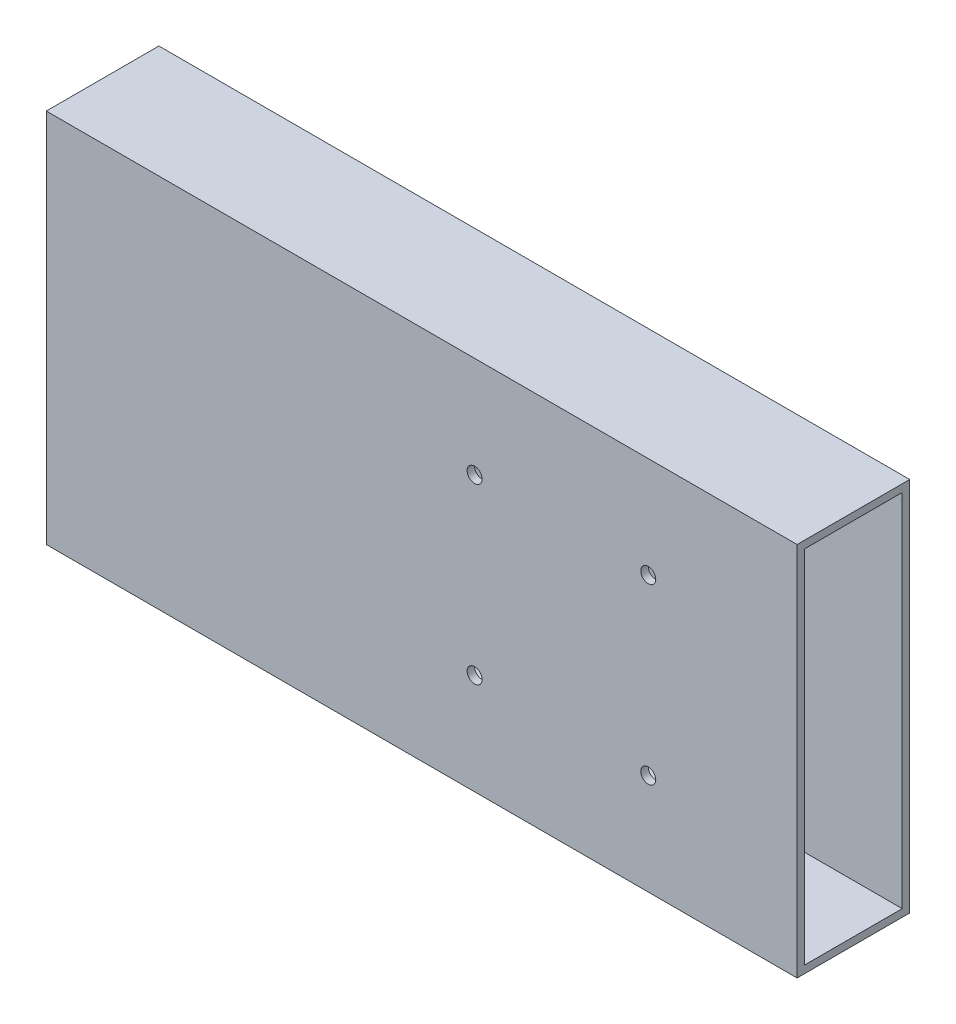
ISO-10303-21;
HEADER;
FILE_DESCRIPTION(('STEP AP214'),'2;1');
FILE_NAME('part.step','',(''),(''),'','','');
FILE_SCHEMA(('AUTOMOTIVE_DESIGN { 1 0 10303 214 1 1 1 1 }'));
ENDSEC;
DATA;
#1=APPLICATION_CONTEXT('core data for automotive mechanical design processes');
#2=APPLICATION_PROTOCOL_DEFINITION('international standard','automotive_design',2000,#1);
#3=PRODUCT_CONTEXT('',#1,'mechanical');
#4=PRODUCT('Part','Part','',(#3));
#5=PRODUCT_RELATED_PRODUCT_CATEGORY('part','',(#4));
#6=PRODUCT_DEFINITION_FORMATION('','',#4);
#7=PRODUCT_DEFINITION_CONTEXT('part definition',#1,'design');
#8=PRODUCT_DEFINITION('design','',#6,#7);
#9=PRODUCT_DEFINITION_SHAPE('','',#8);
#10=(LENGTH_UNIT() NAMED_UNIT(*) SI_UNIT(.MILLI.,.METRE.));
#11=(NAMED_UNIT(*) PLANE_ANGLE_UNIT() SI_UNIT($,.RADIAN.));
#12=(NAMED_UNIT(*) SI_UNIT($,.STERADIAN.) SOLID_ANGLE_UNIT());
#13=UNCERTAINTY_MEASURE_WITH_UNIT(LENGTH_MEASURE(1.E-05),#10,'distance_accuracy_value','');
#14=(GEOMETRIC_REPRESENTATION_CONTEXT(3) GLOBAL_UNCERTAINTY_ASSIGNED_CONTEXT((#13)) GLOBAL_UNIT_ASSIGNED_CONTEXT((#10,
#11,#12)) REPRESENTATION_CONTEXT('',''));
#15=CARTESIAN_POINT('',(0.,0.,0.));
#16=DIRECTION('',(0.,0.,1.));
#17=DIRECTION('',(1.,0.,0.));
#18=AXIS2_PLACEMENT_3D('',#15,#16,#17);
#19=CARTESIAN_POINT('',(0.,0.,60.));
#20=DIRECTION('',(-1.,0.,0.));
#21=DIRECTION('',(0.,0.,1.));
#22=AXIS2_PLACEMENT_3D('',#19,#20,#21);
#23=PLANE('',#22);
#24=DIRECTION('',(0.,1.,0.));
#25=VECTOR('',#24,1.);
#26=CARTESIAN_POINT('',(0.,0.,0.));
#27=LINE('',#26,#25);
#28=CARTESIAN_POINT('',(0.,0.,0.));
#29=VERTEX_POINT('',#28);
#30=CARTESIAN_POINT('',(0.,200.,0.));
#31=VERTEX_POINT('',#30);
#32=EDGE_CURVE('E127',#29,#31,#27,.T.);
#33=ORIENTED_EDGE('',*,*,#32,.T.);
#34=DIRECTION('',(0.,0.,-1.));
#35=VECTOR('',#34,1.);
#36=CARTESIAN_POINT('',(0.,200.,60.));
#37=LINE('',#36,#35);
#38=CARTESIAN_POINT('',(0.,200.,60.));
#39=VERTEX_POINT('',#38);
#40=EDGE_CURVE('E11',#39,#31,#37,.T.);
#41=ORIENTED_EDGE('',*,*,#40,.F.);
#42=DIRECTION('',(0.,1.,0.));
#43=VECTOR('',#42,1.);
#44=CARTESIAN_POINT('',(0.,0.,60.));
#45=LINE('',#44,#43);
#46=CARTESIAN_POINT('',(0.,0.,60.));
#47=VERTEX_POINT('',#46);
#48=EDGE_CURVE('E133',#47,#39,#45,.T.);
#49=ORIENTED_EDGE('',*,*,#48,.F.);
#50=DIRECTION('',(0.,0.,-1.));
#51=VECTOR('',#50,1.);
#52=CARTESIAN_POINT('',(0.,0.,60.));
#53=LINE('',#52,#51);
#54=EDGE_CURVE('E143',#47,#29,#53,.T.);
#55=ORIENTED_EDGE('',*,*,#54,.T.);
#56=EDGE_LOOP('',(#33,#41,#49,#55));
#57=FACE_BOUND('',#56,.T.);
#58=DIRECTION('',(0.,1.,0.));
#59=VECTOR('',#58,1.);
#60=CARTESIAN_POINT('',(0.,0.,4.));
#61=LINE('',#60,#59);
#62=CARTESIAN_POINT('',(0.,4.,4.));
#63=VERTEX_POINT('',#62);
#64=CARTESIAN_POINT('',(0.,196.,4.));
#65=VERTEX_POINT('',#64);
#66=EDGE_CURVE('E103',#63,#65,#61,.T.);
#67=ORIENTED_EDGE('',*,*,#66,.F.);
#68=DIRECTION('',(0.,0.,-1.));
#69=VECTOR('',#68,1.);
#70=CARTESIAN_POINT('',(0.,4.,60.));
#71=LINE('',#70,#69);
#72=CARTESIAN_POINT('',(0.,4.,56.));
#73=VERTEX_POINT('',#72);
#74=EDGE_CURVE('E123',#73,#63,#71,.T.);
#75=ORIENTED_EDGE('',*,*,#74,.F.);
#76=DIRECTION('',(0.,1.,0.));
#77=VECTOR('',#76,1.);
#78=CARTESIAN_POINT('',(0.,0.,56.));
#79=LINE('',#78,#77);
#80=CARTESIAN_POINT('',(0.,196.,56.));
#81=VERTEX_POINT('',#80);
#82=EDGE_CURVE('E47',#73,#81,#79,.T.);
#83=ORIENTED_EDGE('',*,*,#82,.T.);
#84=DIRECTION('',(0.,0.,-1.));
#85=VECTOR('',#84,1.);
#86=CARTESIAN_POINT('',(0.,196.,60.));
#87=LINE('',#86,#85);
#88=EDGE_CURVE('E113',#81,#65,#87,.T.);
#89=ORIENTED_EDGE('',*,*,#88,.T.);
#90=EDGE_LOOP('',(#67,#75,#83,#89));
#91=FACE_BOUND('',#90,.T.);
#92=ADVANCED_FACE('F33',(#57,#91),#23,.F.);
#93=CARTESIAN_POINT('',(-400.,0.,60.));
#94=DIRECTION('',(1.,0.,0.));
#95=DIRECTION('',(0.,0.,-1.));
#96=AXIS2_PLACEMENT_3D('',#93,#94,#95);
#97=PLANE('',#96);
#98=DIRECTION('',(0.,-1.,0.));
#99=VECTOR('',#98,1.);
#100=CARTESIAN_POINT('',(-400.,0.,0.));
#101=LINE('',#100,#99);
#102=CARTESIAN_POINT('',(-400.,200.,0.));
#103=VERTEX_POINT('',#102);
#104=CARTESIAN_POINT('',(-400.,0.,0.));
#105=VERTEX_POINT('',#104);
#106=EDGE_CURVE('E148',#103,#105,#101,.T.);
#107=ORIENTED_EDGE('',*,*,#106,.T.);
#108=DIRECTION('',(0.,0.,-1.));
#109=VECTOR('',#108,1.);
#110=CARTESIAN_POINT('',(-400.,0.,60.));
#111=LINE('',#110,#109);
#112=CARTESIAN_POINT('',(-400.,0.,60.));
#113=VERTEX_POINT('',#112);
#114=EDGE_CURVE('E153',#113,#105,#111,.T.);
#115=ORIENTED_EDGE('',*,*,#114,.F.);
#116=DIRECTION('',(0.,-1.,0.));
#117=VECTOR('',#116,1.);
#118=CARTESIAN_POINT('',(-400.,0.,60.));
#119=LINE('',#118,#117);
#120=CARTESIAN_POINT('',(-400.,200.,60.));
#121=VERTEX_POINT('',#120);
#122=EDGE_CURVE('E139',#121,#113,#119,.T.);
#123=ORIENTED_EDGE('',*,*,#122,.F.);
#124=DIRECTION('',(0.,0.,-1.));
#125=VECTOR('',#124,1.);
#126=CARTESIAN_POINT('',(-400.,200.,60.));
#127=LINE('',#126,#125);
#128=EDGE_CURVE('E40',#121,#103,#127,.T.);
#129=ORIENTED_EDGE('',*,*,#128,.T.);
#130=EDGE_LOOP('',(#107,#115,#123,#129));
#131=FACE_BOUND('',#130,.T.);
#132=DIRECTION('',(0.,-1.,0.));
#133=VECTOR('',#132,1.);
#134=CARTESIAN_POINT('',(-400.,0.,4.));
#135=LINE('',#134,#133);
#136=CARTESIAN_POINT('',(-400.,196.,4.));
#137=VERTEX_POINT('',#136);
#138=CARTESIAN_POINT('',(-400.,3.99999999999995,4.));
#139=VERTEX_POINT('',#138);
#140=EDGE_CURVE('E100',#137,#139,#135,.T.);
#141=ORIENTED_EDGE('',*,*,#140,.F.);
#142=DIRECTION('',(0.,0.,-1.));
#143=VECTOR('',#142,1.);
#144=CARTESIAN_POINT('',(-400.,196.,60.));
#145=LINE('',#144,#143);
#146=CARTESIAN_POINT('',(-400.,196.,56.));
#147=VERTEX_POINT('',#146);
#148=EDGE_CURVE('E109',#147,#137,#145,.T.);
#149=ORIENTED_EDGE('',*,*,#148,.F.);
#150=DIRECTION('',(0.,-1.,0.));
#151=VECTOR('',#150,1.);
#152=CARTESIAN_POINT('',(-400.,0.,56.));
#153=LINE('',#152,#151);
#154=CARTESIAN_POINT('',(-400.,3.99999999999995,56.));
#155=VERTEX_POINT('',#154);
#156=EDGE_CURVE('E52',#147,#155,#153,.T.);
#157=ORIENTED_EDGE('',*,*,#156,.T.);
#158=DIRECTION('',(0.,0.,-1.));
#159=VECTOR('',#158,1.);
#160=CARTESIAN_POINT('',(-400.,3.99999999999995,60.));
#161=LINE('',#160,#159);
#162=EDGE_CURVE('E114',#155,#139,#161,.T.);
#163=ORIENTED_EDGE('',*,*,#162,.T.);
#164=EDGE_LOOP('',(#141,#149,#157,#163));
#165=FACE_BOUND('',#164,.T.);
#166=ADVANCED_FACE('F117',(#131,#165),#97,.F.);
#167=CARTESIAN_POINT('',(0.,200.,60.));
#168=DIRECTION('',(0.,-1.,0.));
#169=DIRECTION('',(1.,0.,0.));
#170=AXIS2_PLACEMENT_3D('',#167,#168,#169);
#171=PLANE('',#170);
#172=DIRECTION('',(-1.,0.,0.));
#173=VECTOR('',#172,1.);
#174=CARTESIAN_POINT('',(0.,200.,0.));
#175=LINE('',#174,#173);
#176=EDGE_CURVE('E146',#31,#103,#175,.T.);
#177=ORIENTED_EDGE('',*,*,#176,.T.);
#178=ORIENTED_EDGE('',*,*,#128,.F.);
#179=DIRECTION('',(-1.,0.,0.));
#180=VECTOR('',#179,1.);
#181=CARTESIAN_POINT('',(0.,200.,60.));
#182=LINE('',#181,#180);
#183=EDGE_CURVE('E136',#39,#121,#182,.T.);
#184=ORIENTED_EDGE('',*,*,#183,.F.);
#185=ORIENTED_EDGE('',*,*,#40,.T.);
#186=EDGE_LOOP('',(#177,#178,#184,#185));
#187=FACE_BOUND('',#186,.T.);
#188=ADVANCED_FACE('F176',(#187),#171,.F.);
#189=CARTESIAN_POINT('',(0.,0.,60.));
#190=DIRECTION('',(0.,1.,0.));
#191=DIRECTION('',(-1.,0.,0.));
#192=AXIS2_PLACEMENT_3D('',#189,#190,#191);
#193=PLANE('',#192);
#194=DIRECTION('',(1.,0.,0.));
#195=VECTOR('',#194,1.);
#196=CARTESIAN_POINT('',(0.,0.,0.));
#197=LINE('',#196,#195);
#198=EDGE_CURVE('E137',#105,#29,#197,.T.);
#199=ORIENTED_EDGE('',*,*,#198,.T.);
#200=ORIENTED_EDGE('',*,*,#54,.F.);
#201=DIRECTION('',(1.,0.,0.));
#202=VECTOR('',#201,1.);
#203=CARTESIAN_POINT('',(0.,0.,60.));
#204=LINE('',#203,#202);
#205=EDGE_CURVE('E141',#113,#47,#204,.T.);
#206=ORIENTED_EDGE('',*,*,#205,.F.);
#207=ORIENTED_EDGE('',*,*,#114,.T.);
#208=EDGE_LOOP('',(#199,#200,#206,#207));
#209=FACE_BOUND('',#208,.T.);
#210=ADVANCED_FACE('F168',(#209),#193,.F.);
#211=CARTESIAN_POINT('',(0.,0.,60.));
#212=DIRECTION('',(0.,0.,1.));
#213=DIRECTION('',(1.,0.,0.));
#214=AXIS2_PLACEMENT_3D('',#211,#212,#213);
#215=PLANE('',#214);
#216=CARTESIAN_POINT('',(-171.797757223373,146.25,60.));
#217=DIRECTION('',(0.,0.,1.));
#218=DIRECTION('',(1.,0.,0.));
#219=AXIS2_PLACEMENT_3D('',#216,#217,#218);
#220=CIRCLE('',#219,3.99999999999999);
#221=CARTESIAN_POINT('',(-167.797757223373,146.25,60.));
#222=VERTEX_POINT('',#221);
#223=EDGE_CURVE('E301',#222,#222,#220,.T.);
#224=ORIENTED_EDGE('',*,*,#223,.F.);
#225=EDGE_LOOP('',(#224));
#226=FACE_BOUND('',#225,.T.);
#227=CARTESIAN_POINT('',(-79.2977572233733,53.75,60.));
#228=DIRECTION('',(0.,0.,1.));
#229=DIRECTION('',(-1.,0.,0.));
#230=AXIS2_PLACEMENT_3D('',#227,#228,#229);
#231=CIRCLE('',#230,4.00000000000001);
#232=CARTESIAN_POINT('',(-83.2977572233733,53.75,60.));
#233=VERTEX_POINT('',#232);
#234=EDGE_CURVE('E312',#233,#233,#231,.T.);
#235=ORIENTED_EDGE('',*,*,#234,.F.);
#236=EDGE_LOOP('',(#235));
#237=FACE_BOUND('',#236,.T.);
#238=CARTESIAN_POINT('',(-171.797757223373,53.75,60.));
#239=DIRECTION('',(0.,0.,1.));
#240=DIRECTION('',(-1.,0.,0.));
#241=AXIS2_PLACEMENT_3D('',#238,#239,#240);
#242=CIRCLE('',#241,3.99999999999999);
#243=CARTESIAN_POINT('',(-175.797757223373,53.75,60.));
#244=VERTEX_POINT('',#243);
#245=EDGE_CURVE('E318',#244,#244,#242,.T.);
#246=ORIENTED_EDGE('',*,*,#245,.F.);
#247=EDGE_LOOP('',(#246));
#248=FACE_BOUND('',#247,.T.);
#249=CARTESIAN_POINT('',(-79.2977572233733,146.25,60.));
#250=DIRECTION('',(0.,0.,1.));
#251=DIRECTION('',(1.,0.,0.));
#252=AXIS2_PLACEMENT_3D('',#249,#250,#251);
#253=CIRCLE('',#252,4.00000000000001);
#254=CARTESIAN_POINT('',(-75.2977572233733,146.25,60.));
#255=VERTEX_POINT('',#254);
#256=EDGE_CURVE('E305',#255,#255,#253,.T.);
#257=ORIENTED_EDGE('',*,*,#256,.F.);
#258=EDGE_LOOP('',(#257));
#259=FACE_BOUND('',#258,.T.);
#260=ORIENTED_EDGE('',*,*,#48,.T.);
#261=ORIENTED_EDGE('',*,*,#183,.T.);
#262=ORIENTED_EDGE('',*,*,#122,.T.);
#263=ORIENTED_EDGE('',*,*,#205,.T.);
#264=EDGE_LOOP('',(#260,#261,#262,#263));
#265=FACE_BOUND('',#264,.T.);
#266=ADVANCED_FACE('F175',(#226,#237,#248,#259,#265),#215,.T.);
#267=CARTESIAN_POINT('',(0.,0.,0.));
#268=DIRECTION('',(0.,0.,1.));
#269=DIRECTION('',(1.,0.,0.));
#270=AXIS2_PLACEMENT_3D('',#267,#268,#269);
#271=PLANE('',#270);
#272=ORIENTED_EDGE('',*,*,#32,.F.);
#273=ORIENTED_EDGE('',*,*,#198,.F.);
#274=ORIENTED_EDGE('',*,*,#106,.F.);
#275=ORIENTED_EDGE('',*,*,#176,.F.);
#276=EDGE_LOOP('',(#272,#273,#274,#275));
#277=FACE_BOUND('',#276,.T.);
#278=ADVANCED_FACE('F165',(#277),#271,.F.);
#279=CARTESIAN_POINT('',(0.,196.,60.));
#280=DIRECTION('',(0.,-1.,0.));
#281=DIRECTION('',(1.,0.,0.));
#282=AXIS2_PLACEMENT_3D('',#279,#280,#281);
#283=PLANE('',#282);
#284=DIRECTION('',(-1.,0.,0.));
#285=VECTOR('',#284,1.);
#286=CARTESIAN_POINT('',(0.,196.,4.));
#287=LINE('',#286,#285);
#288=EDGE_CURVE('E96',#65,#137,#287,.T.);
#289=ORIENTED_EDGE('',*,*,#288,.F.);
#290=ORIENTED_EDGE('',*,*,#88,.F.);
#291=DIRECTION('',(-1.,0.,0.));
#292=VECTOR('',#291,1.);
#293=CARTESIAN_POINT('',(0.,196.,56.));
#294=LINE('',#293,#292);
#295=EDGE_CURVE('E111',#81,#147,#294,.T.);
#296=ORIENTED_EDGE('',*,*,#295,.T.);
#297=ORIENTED_EDGE('',*,*,#148,.T.);
#298=EDGE_LOOP('',(#289,#290,#296,#297));
#299=FACE_BOUND('',#298,.T.);
#300=ADVANCED_FACE('F110',(#299),#283,.T.);
#301=CARTESIAN_POINT('',(0.,4.,60.));
#302=DIRECTION('',(0.,1.,0.));
#303=DIRECTION('',(-1.,0.,0.));
#304=AXIS2_PLACEMENT_3D('',#301,#302,#303);
#305=PLANE('',#304);
#306=DIRECTION('',(1.,0.,0.));
#307=VECTOR('',#306,1.);
#308=CARTESIAN_POINT('',(0.,4.,4.));
#309=LINE('',#308,#307);
#310=EDGE_CURVE('E118',#139,#63,#309,.T.);
#311=ORIENTED_EDGE('',*,*,#310,.F.);
#312=ORIENTED_EDGE('',*,*,#162,.F.);
#313=DIRECTION('',(1.,0.,0.));
#314=VECTOR('',#313,1.);
#315=CARTESIAN_POINT('',(0.,4.,56.));
#316=LINE('',#315,#314);
#317=EDGE_CURVE('E125',#155,#73,#316,.T.);
#318=ORIENTED_EDGE('',*,*,#317,.T.);
#319=ORIENTED_EDGE('',*,*,#74,.T.);
#320=EDGE_LOOP('',(#311,#312,#318,#319));
#321=FACE_BOUND('',#320,.T.);
#322=ADVANCED_FACE('F202',(#321),#305,.T.);
#323=CARTESIAN_POINT('',(0.,0.,56.));
#324=DIRECTION('',(0.,0.,1.));
#325=DIRECTION('',(1.,0.,0.));
#326=AXIS2_PLACEMENT_3D('',#323,#324,#325);
#327=PLANE('',#326);
#328=CARTESIAN_POINT('',(-171.797757223373,146.25,56.));
#329=DIRECTION('',(0.,0.,1.));
#330=DIRECTION('',(1.,0.,0.));
#331=AXIS2_PLACEMENT_3D('',#328,#329,#330);
#332=CIRCLE('',#331,3.99999999999999);
#333=CARTESIAN_POINT('',(-167.797757223373,146.25,56.));
#334=VERTEX_POINT('',#333);
#335=EDGE_CURVE('E304',#334,#334,#332,.F.);
#336=ORIENTED_EDGE('',*,*,#335,.F.);
#337=EDGE_LOOP('',(#336));
#338=FACE_BOUND('',#337,.T.);
#339=CARTESIAN_POINT('',(-79.2977572233733,53.75,56.));
#340=DIRECTION('',(0.,0.,1.));
#341=DIRECTION('',(1.,0.,0.));
#342=AXIS2_PLACEMENT_3D('',#339,#340,#341);
#343=CIRCLE('',#342,4.00000000000001);
#344=CARTESIAN_POINT('',(-75.2977572233733,53.75,56.));
#345=VERTEX_POINT('',#344);
#346=EDGE_CURVE('E309',#345,#345,#343,.F.);
#347=ORIENTED_EDGE('',*,*,#346,.F.);
#348=EDGE_LOOP('',(#347));
#349=FACE_BOUND('',#348,.T.);
#350=CARTESIAN_POINT('',(-171.797757223373,53.75,56.));
#351=DIRECTION('',(0.,0.,1.));
#352=DIRECTION('',(1.,0.,0.));
#353=AXIS2_PLACEMENT_3D('',#350,#351,#352);
#354=CIRCLE('',#353,3.99999999999999);
#355=CARTESIAN_POINT('',(-167.797757223373,53.75,56.));
#356=VERTEX_POINT('',#355);
#357=EDGE_CURVE('E315',#356,#356,#354,.F.);
#358=ORIENTED_EDGE('',*,*,#357,.F.);
#359=EDGE_LOOP('',(#358));
#360=FACE_BOUND('',#359,.T.);
#361=CARTESIAN_POINT('',(-79.2977572233733,146.25,56.));
#362=DIRECTION('',(0.,0.,1.));
#363=DIRECTION('',(1.,0.,0.));
#364=AXIS2_PLACEMENT_3D('',#361,#362,#363);
#365=CIRCLE('',#364,4.00000000000001);
#366=CARTESIAN_POINT('',(-75.2977572233733,146.25,56.));
#367=VERTEX_POINT('',#366);
#368=EDGE_CURVE('E132',#367,#367,#365,.F.);
#369=ORIENTED_EDGE('',*,*,#368,.F.);
#370=EDGE_LOOP('',(#369));
#371=FACE_BOUND('',#370,.T.);
#372=ORIENTED_EDGE('',*,*,#82,.F.);
#373=ORIENTED_EDGE('',*,*,#317,.F.);
#374=ORIENTED_EDGE('',*,*,#156,.F.);
#375=ORIENTED_EDGE('',*,*,#295,.F.);
#376=EDGE_LOOP('',(#372,#373,#374,#375));
#377=FACE_BOUND('',#376,.T.);
#378=ADVANCED_FACE('F212',(#338,#349,#360,#371,#377),#327,.F.);
#379=CARTESIAN_POINT('',(0.,0.,4.));
#380=DIRECTION('',(0.,0.,1.));
#381=DIRECTION('',(1.,0.,0.));
#382=AXIS2_PLACEMENT_3D('',#379,#380,#381);
#383=PLANE('',#382);
#384=ORIENTED_EDGE('',*,*,#66,.T.);
#385=ORIENTED_EDGE('',*,*,#288,.T.);
#386=ORIENTED_EDGE('',*,*,#140,.T.);
#387=ORIENTED_EDGE('',*,*,#310,.T.);
#388=EDGE_LOOP('',(#384,#385,#386,#387));
#389=FACE_BOUND('',#388,.T.);
#390=ADVANCED_FACE('F98',(#389),#383,.T.);
#391=CARTESIAN_POINT('',(-79.2977572233733,146.25,-0.001000000000001));
#392=DIRECTION('',(0.,0.,1.));
#393=DIRECTION('',(1.,0.,0.));
#394=AXIS2_PLACEMENT_3D('',#391,#392,#393);
#395=CYLINDRICAL_SURFACE('',#394,4.00000000000001);
#396=ORIENTED_EDGE('',*,*,#256,.T.);
#397=EDGE_LOOP('',(#396));
#398=FACE_BOUND('',#397,.T.);
#399=ORIENTED_EDGE('',*,*,#368,.T.);
#400=EDGE_LOOP('',(#399));
#401=FACE_BOUND('',#400,.T.);
#402=ADVANCED_FACE('F224',(#398,#401),#395,.F.);
#403=CARTESIAN_POINT('',(-171.797757223373,53.75,-0.001000000000001));
#404=DIRECTION('',(0.,0.,1.));
#405=DIRECTION('',(1.,0.,0.));
#406=AXIS2_PLACEMENT_3D('',#403,#404,#405);
#407=CYLINDRICAL_SURFACE('',#406,3.99999999999999);
#408=ORIENTED_EDGE('',*,*,#245,.T.);
#409=EDGE_LOOP('',(#408));
#410=FACE_BOUND('',#409,.T.);
#411=ORIENTED_EDGE('',*,*,#357,.T.);
#412=EDGE_LOOP('',(#411));
#413=FACE_BOUND('',#412,.T.);
#414=ADVANCED_FACE('F250',(#410,#413),#407,.F.);
#415=CARTESIAN_POINT('',(-79.2977572233733,53.75,-0.001000000000001));
#416=DIRECTION('',(0.,0.,1.));
#417=DIRECTION('',(1.,0.,0.));
#418=AXIS2_PLACEMENT_3D('',#415,#416,#417);
#419=CYLINDRICAL_SURFACE('',#418,4.00000000000001);
#420=ORIENTED_EDGE('',*,*,#234,.T.);
#421=EDGE_LOOP('',(#420));
#422=FACE_BOUND('',#421,.T.);
#423=ORIENTED_EDGE('',*,*,#346,.T.);
#424=EDGE_LOOP('',(#423));
#425=FACE_BOUND('',#424,.T.);
#426=ADVANCED_FACE('F260',(#422,#425),#419,.F.);
#427=CARTESIAN_POINT('',(-171.797757223373,146.25,-0.001000000000001));
#428=DIRECTION('',(0.,0.,1.));
#429=DIRECTION('',(1.,0.,0.));
#430=AXIS2_PLACEMENT_3D('',#427,#428,#429);
#431=CYLINDRICAL_SURFACE('',#430,3.99999999999999);
#432=ORIENTED_EDGE('',*,*,#223,.T.);
#433=EDGE_LOOP('',(#432));
#434=FACE_BOUND('',#433,.T.);
#435=ORIENTED_EDGE('',*,*,#335,.T.);
#436=EDGE_LOOP('',(#435));
#437=FACE_BOUND('',#436,.T.);
#438=ADVANCED_FACE('F270',(#434,#437),#431,.F.);
#439=CLOSED_SHELL('',(#92,#166,#188,#210,#266,#278,#300,#322,#378,#390,#402,#414,#426,#438));
#440=MANIFOLD_SOLID_BREP('B2',#439);
#441=ADVANCED_BREP_SHAPE_REPRESENTATION('',(#18,#440),#14);
#442=SHAPE_DEFINITION_REPRESENTATION(#9,#441);
ENDSEC;
END-ISO-10303-21;
